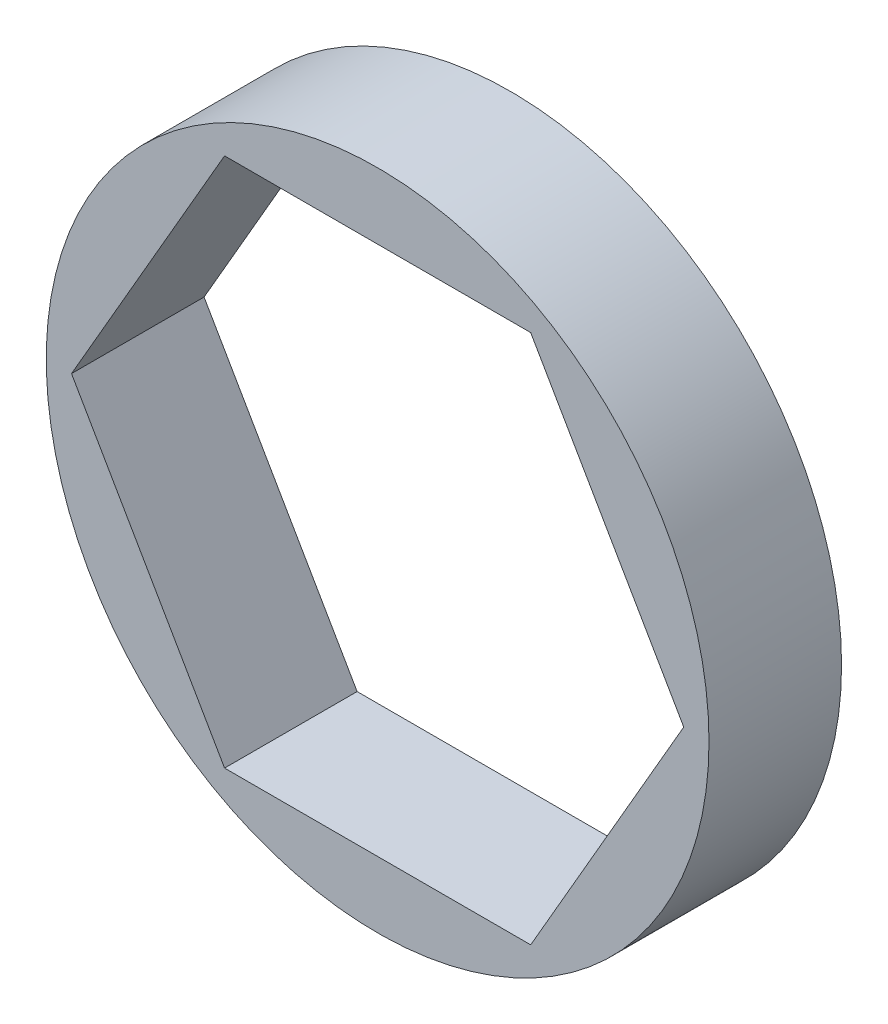
ISO-10303-21;
HEADER;
FILE_DESCRIPTION(('STEP AP214'),'2;1');
FILE_NAME('part.step','',(''),(''),'','','');
FILE_SCHEMA(('AUTOMOTIVE_DESIGN { 1 0 10303 214 1 1 1 1 }'));
ENDSEC;
DATA;
#1=APPLICATION_CONTEXT('core data for automotive mechanical design processes');
#2=APPLICATION_PROTOCOL_DEFINITION('international standard','automotive_design',2000,#1);
#3=PRODUCT_CONTEXT('',#1,'mechanical');
#4=PRODUCT('Part','Part','',(#3));
#5=PRODUCT_RELATED_PRODUCT_CATEGORY('part','',(#4));
#6=PRODUCT_DEFINITION_FORMATION('','',#4);
#7=PRODUCT_DEFINITION_CONTEXT('part definition',#1,'design');
#8=PRODUCT_DEFINITION('design','',#6,#7);
#9=PRODUCT_DEFINITION_SHAPE('','',#8);
#10=(LENGTH_UNIT() NAMED_UNIT(*) SI_UNIT(.MILLI.,.METRE.));
#11=(NAMED_UNIT(*) PLANE_ANGLE_UNIT() SI_UNIT($,.RADIAN.));
#12=(NAMED_UNIT(*) SI_UNIT($,.STERADIAN.) SOLID_ANGLE_UNIT());
#13=UNCERTAINTY_MEASURE_WITH_UNIT(LENGTH_MEASURE(1.E-05),#10,'distance_accuracy_value','');
#14=(GEOMETRIC_REPRESENTATION_CONTEXT(3) GLOBAL_UNCERTAINTY_ASSIGNED_CONTEXT((#13)) GLOBAL_UNIT_ASSIGNED_CONTEXT((#10,
#11,#12)) REPRESENTATION_CONTEXT('',''));
#15=CARTESIAN_POINT('',(0.,0.,0.));
#16=DIRECTION('',(0.,0.,1.));
#17=DIRECTION('',(1.,0.,0.));
#18=AXIS2_PLACEMENT_3D('',#15,#16,#17);
#19=CARTESIAN_POINT('',(0.,0.,3.175));
#20=DIRECTION('',(0.,0.,1.));
#21=DIRECTION('',(1.,0.,0.));
#22=AXIS2_PLACEMENT_3D('',#19,#20,#21);
#23=PLANE('',#22);
#24=CARTESIAN_POINT('',(0.,0.,3.175));
#25=DIRECTION('',(0.,0.,1.));
#26=DIRECTION('',(1.,0.,0.));
#27=AXIS2_PLACEMENT_3D('',#24,#25,#26);
#28=CIRCLE('',#27,7.9375);
#29=CARTESIAN_POINT('',(7.9375,0.,3.175));
#30=VERTEX_POINT('',#29);
#31=EDGE_CURVE('E11',#30,#30,#28,.T.);
#32=ORIENTED_EDGE('',*,*,#31,.T.);
#33=EDGE_LOOP('',(#32));
#34=FACE_BOUND('',#33,.T.);
#35=DIRECTION('',(1.,0.,0.));
#36=VECTOR('',#35,1.);
#37=CARTESIAN_POINT('',(-3.66617420935412,-6.35,3.175));
#38=LINE('',#37,#36);
#39=CARTESIAN_POINT('',(-3.66617420935412,-6.35,3.175));
#40=VERTEX_POINT('',#39);
#41=CARTESIAN_POINT('',(3.66617420935412,-6.35,3.175));
#42=VERTEX_POINT('',#41);
#43=EDGE_CURVE('E94',#40,#42,#38,.T.);
#44=ORIENTED_EDGE('',*,*,#43,.F.);
#45=DIRECTION('',(0.5,-0.866025403784438,0.));
#46=VECTOR('',#45,1.);
#47=CARTESIAN_POINT('',(-7.33234841870825,0.,3.175));
#48=LINE('',#47,#46);
#49=CARTESIAN_POINT('',(-7.33234841870825,0.,3.175));
#50=VERTEX_POINT('',#49);
#51=EDGE_CURVE('E86',#50,#40,#48,.T.);
#52=ORIENTED_EDGE('',*,*,#51,.F.);
#53=DIRECTION('',(-0.5,-0.866025403784439,0.));
#54=VECTOR('',#53,1.);
#55=CARTESIAN_POINT('',(-3.66617420935412,6.35,3.175));
#56=LINE('',#55,#54);
#57=CARTESIAN_POINT('',(-3.66617420935412,6.35,3.175));
#58=VERTEX_POINT('',#57);
#59=EDGE_CURVE('E114',#58,#50,#56,.T.);
#60=ORIENTED_EDGE('',*,*,#59,.F.);
#61=DIRECTION('',(-1.,0.,0.));
#62=VECTOR('',#61,1.);
#63=CARTESIAN_POINT('',(3.66617420935412,6.35,3.175));
#64=LINE('',#63,#62);
#65=CARTESIAN_POINT('',(3.66617420935412,6.35,3.175));
#66=VERTEX_POINT('',#65);
#67=EDGE_CURVE('E112',#66,#58,#64,.T.);
#68=ORIENTED_EDGE('',*,*,#67,.F.);
#69=DIRECTION('',(-0.5,0.866025403784438,0.));
#70=VECTOR('',#69,1.);
#71=CARTESIAN_POINT('',(7.33234841870824,0.,3.175));
#72=LINE('',#71,#70);
#73=CARTESIAN_POINT('',(7.33234841870824,0.,3.175));
#74=VERTEX_POINT('',#73);
#75=EDGE_CURVE('E108',#74,#66,#72,.T.);
#76=ORIENTED_EDGE('',*,*,#75,.F.);
#77=DIRECTION('',(0.5,0.866025403784439,0.));
#78=VECTOR('',#77,1.);
#79=CARTESIAN_POINT('',(3.66617420935412,-6.35,3.175));
#80=LINE('',#79,#78);
#81=EDGE_CURVE('E106',#42,#74,#80,.T.);
#82=ORIENTED_EDGE('',*,*,#81,.F.);
#83=EDGE_LOOP('',(#44,#52,#60,#68,#76,#82));
#84=FACE_BOUND('',#83,.T.);
#85=ADVANCED_FACE('F33',(#34,#84),#23,.T.);
#86=CARTESIAN_POINT('',(0.,0.,0.));
#87=DIRECTION('',(0.,0.,1.));
#88=DIRECTION('',(1.,0.,0.));
#89=AXIS2_PLACEMENT_3D('',#86,#87,#88);
#90=PLANE('',#89);
#91=CARTESIAN_POINT('',(0.,0.,0.));
#92=DIRECTION('',(0.,0.,1.));
#93=DIRECTION('',(1.,0.,0.));
#94=AXIS2_PLACEMENT_3D('',#91,#92,#93);
#95=CIRCLE('',#94,7.9375);
#96=CARTESIAN_POINT('',(7.9375,0.,0.));
#97=VERTEX_POINT('',#96);
#98=EDGE_CURVE('E37',#97,#97,#95,.T.);
#99=ORIENTED_EDGE('',*,*,#98,.F.);
#100=EDGE_LOOP('',(#99));
#101=FACE_BOUND('',#100,.T.);
#102=DIRECTION('',(0.5,-0.866025403784438,0.));
#103=VECTOR('',#102,1.);
#104=CARTESIAN_POINT('',(-7.33234841870825,0.,0.));
#105=LINE('',#104,#103);
#106=CARTESIAN_POINT('',(-7.33234841870825,0.,0.));
#107=VERTEX_POINT('',#106);
#108=CARTESIAN_POINT('',(-3.66617420935412,-6.35,0.));
#109=VERTEX_POINT('',#108);
#110=EDGE_CURVE('E56',#107,#109,#105,.T.);
#111=ORIENTED_EDGE('',*,*,#110,.T.);
#112=DIRECTION('',(1.,0.,0.));
#113=VECTOR('',#112,1.);
#114=CARTESIAN_POINT('',(-3.66617420935412,-6.35,0.));
#115=LINE('',#114,#113);
#116=CARTESIAN_POINT('',(3.66617420935412,-6.35,0.));
#117=VERTEX_POINT('',#116);
#118=EDGE_CURVE('E101',#109,#117,#115,.T.);
#119=ORIENTED_EDGE('',*,*,#118,.T.);
#120=DIRECTION('',(0.5,0.866025403784439,0.));
#121=VECTOR('',#120,1.);
#122=CARTESIAN_POINT('',(3.66617420935412,-6.35,0.));
#123=LINE('',#122,#121);
#124=CARTESIAN_POINT('',(7.33234841870824,0.,0.));
#125=VERTEX_POINT('',#124);
#126=EDGE_CURVE('E118',#117,#125,#123,.T.);
#127=ORIENTED_EDGE('',*,*,#126,.T.);
#128=DIRECTION('',(-0.5,0.866025403784438,0.));
#129=VECTOR('',#128,1.);
#130=CARTESIAN_POINT('',(7.33234841870824,0.,0.));
#131=LINE('',#130,#129);
#132=CARTESIAN_POINT('',(3.66617420935412,6.35,0.));
#133=VERTEX_POINT('',#132);
#134=EDGE_CURVE('E121',#125,#133,#131,.T.);
#135=ORIENTED_EDGE('',*,*,#134,.T.);
#136=DIRECTION('',(-1.,0.,0.));
#137=VECTOR('',#136,1.);
#138=CARTESIAN_POINT('',(3.66617420935412,6.35,0.));
#139=LINE('',#138,#137);
#140=CARTESIAN_POINT('',(-3.66617420935412,6.35,0.));
#141=VERTEX_POINT('',#140);
#142=EDGE_CURVE('E124',#133,#141,#139,.T.);
#143=ORIENTED_EDGE('',*,*,#142,.T.);
#144=DIRECTION('',(-0.5,-0.866025403784439,0.));
#145=VECTOR('',#144,1.);
#146=CARTESIAN_POINT('',(-3.66617420935412,6.35,0.));
#147=LINE('',#146,#145);
#148=EDGE_CURVE('E95',#141,#107,#147,.T.);
#149=ORIENTED_EDGE('',*,*,#148,.T.);
#150=EDGE_LOOP('',(#111,#119,#127,#135,#143,#149));
#151=FACE_BOUND('',#150,.T.);
#152=ADVANCED_FACE('F141',(#101,#151),#90,.F.);
#153=CARTESIAN_POINT('',(0.,0.,3.175));
#154=DIRECTION('',(0.,0.,-1.));
#155=DIRECTION('',(-1.,0.,0.));
#156=AXIS2_PLACEMENT_3D('',#153,#154,#155);
#157=CYLINDRICAL_SURFACE('',#156,7.9375);
#158=ORIENTED_EDGE('',*,*,#31,.F.);
#159=EDGE_LOOP('',(#158));
#160=FACE_BOUND('',#159,.T.);
#161=ORIENTED_EDGE('',*,*,#98,.T.);
#162=EDGE_LOOP('',(#161));
#163=FACE_BOUND('',#162,.T.);
#164=ADVANCED_FACE('F35',(#160,#163),#157,.T.);
#165=CARTESIAN_POINT('',(-7.33234841870825,0.,3.175));
#166=DIRECTION('',(0.866025403784439,0.5,0.));
#167=DIRECTION('',(-0.5,0.866025403784439,0.));
#168=AXIS2_PLACEMENT_3D('',#165,#166,#167);
#169=PLANE('',#168);
#170=ORIENTED_EDGE('',*,*,#110,.F.);
#171=DIRECTION('',(0.,0.,-1.));
#172=VECTOR('',#171,1.);
#173=CARTESIAN_POINT('',(-7.33234841870825,0.,3.175));
#174=LINE('',#173,#172);
#175=EDGE_CURVE('E90',#50,#107,#174,.T.);
#176=ORIENTED_EDGE('',*,*,#175,.F.);
#177=ORIENTED_EDGE('',*,*,#51,.T.);
#178=DIRECTION('',(0.,0.,-1.));
#179=VECTOR('',#178,1.);
#180=CARTESIAN_POINT('',(-3.66617420935412,-6.35,3.175));
#181=LINE('',#180,#179);
#182=EDGE_CURVE('E89',#40,#109,#181,.T.);
#183=ORIENTED_EDGE('',*,*,#182,.T.);
#184=EDGE_LOOP('',(#170,#176,#177,#183));
#185=FACE_BOUND('',#184,.T.);
#186=ADVANCED_FACE('F88',(#185),#169,.T.);
#187=CARTESIAN_POINT('',(-3.66617420935412,-6.35,3.175));
#188=DIRECTION('',(0.,1.,0.));
#189=DIRECTION('',(-1.,0.,0.));
#190=AXIS2_PLACEMENT_3D('',#187,#188,#189);
#191=PLANE('',#190);
#192=ORIENTED_EDGE('',*,*,#118,.F.);
#193=ORIENTED_EDGE('',*,*,#182,.F.);
#194=ORIENTED_EDGE('',*,*,#43,.T.);
#195=DIRECTION('',(0.,0.,-1.));
#196=VECTOR('',#195,1.);
#197=CARTESIAN_POINT('',(3.66617420935412,-6.35,3.175));
#198=LINE('',#197,#196);
#199=EDGE_CURVE('E102',#42,#117,#198,.T.);
#200=ORIENTED_EDGE('',*,*,#199,.T.);
#201=EDGE_LOOP('',(#192,#193,#194,#200));
#202=FACE_BOUND('',#201,.T.);
#203=ADVANCED_FACE('F98',(#202),#191,.T.);
#204=CARTESIAN_POINT('',(3.66617420935412,-6.35,3.175));
#205=DIRECTION('',(-0.866025403784439,0.5,0.));
#206=DIRECTION('',(-0.5,-0.866025403784439,0.));
#207=AXIS2_PLACEMENT_3D('',#204,#205,#206);
#208=PLANE('',#207);
#209=ORIENTED_EDGE('',*,*,#126,.F.);
#210=ORIENTED_EDGE('',*,*,#199,.F.);
#211=ORIENTED_EDGE('',*,*,#81,.T.);
#212=DIRECTION('',(0.,0.,-1.));
#213=VECTOR('',#212,1.);
#214=CARTESIAN_POINT('',(7.33234841870824,0.,3.175));
#215=LINE('',#214,#213);
#216=EDGE_CURVE('E133',#74,#125,#215,.T.);
#217=ORIENTED_EDGE('',*,*,#216,.T.);
#218=EDGE_LOOP('',(#209,#210,#211,#217));
#219=FACE_BOUND('',#218,.T.);
#220=ADVANCED_FACE('F137',(#219),#208,.T.);
#221=CARTESIAN_POINT('',(7.33234841870824,0.,3.175));
#222=DIRECTION('',(-0.866025403784438,-0.5,0.));
#223=DIRECTION('',(0.500000000000001,-0.866025403784438,0.));
#224=AXIS2_PLACEMENT_3D('',#221,#222,#223);
#225=PLANE('',#224);
#226=ORIENTED_EDGE('',*,*,#134,.F.);
#227=ORIENTED_EDGE('',*,*,#216,.F.);
#228=ORIENTED_EDGE('',*,*,#75,.T.);
#229=DIRECTION('',(0.,0.,-1.));
#230=VECTOR('',#229,1.);
#231=CARTESIAN_POINT('',(3.66617420935412,6.35,3.175));
#232=LINE('',#231,#230);
#233=EDGE_CURVE('E131',#66,#133,#232,.T.);
#234=ORIENTED_EDGE('',*,*,#233,.T.);
#235=EDGE_LOOP('',(#226,#227,#228,#234));
#236=FACE_BOUND('',#235,.T.);
#237=ADVANCED_FACE('F149',(#236),#225,.T.);
#238=CARTESIAN_POINT('',(3.66617420935412,6.35,3.175));
#239=DIRECTION('',(0.,-1.,0.));
#240=DIRECTION('',(1.,0.,0.));
#241=AXIS2_PLACEMENT_3D('',#238,#239,#240);
#242=PLANE('',#241);
#243=ORIENTED_EDGE('',*,*,#142,.F.);
#244=ORIENTED_EDGE('',*,*,#233,.F.);
#245=ORIENTED_EDGE('',*,*,#67,.T.);
#246=DIRECTION('',(0.,0.,-1.));
#247=VECTOR('',#246,1.);
#248=CARTESIAN_POINT('',(-3.66617420935412,6.35,3.175));
#249=LINE('',#248,#247);
#250=EDGE_CURVE('E48',#58,#141,#249,.T.);
#251=ORIENTED_EDGE('',*,*,#250,.T.);
#252=EDGE_LOOP('',(#243,#244,#245,#251));
#253=FACE_BOUND('',#252,.T.);
#254=ADVANCED_FACE('F147',(#253),#242,.T.);
#255=CARTESIAN_POINT('',(-3.66617420935412,6.35,3.175));
#256=DIRECTION('',(0.866025403784439,-0.5,0.));
#257=DIRECTION('',(0.5,0.866025403784439,0.));
#258=AXIS2_PLACEMENT_3D('',#255,#256,#257);
#259=PLANE('',#258);
#260=ORIENTED_EDGE('',*,*,#148,.F.);
#261=ORIENTED_EDGE('',*,*,#250,.F.);
#262=ORIENTED_EDGE('',*,*,#59,.T.);
#263=ORIENTED_EDGE('',*,*,#175,.T.);
#264=EDGE_LOOP('',(#260,#261,#262,#263));
#265=FACE_BOUND('',#264,.T.);
#266=ADVANCED_FACE('F143',(#265),#259,.T.);
#267=CLOSED_SHELL('',(#85,#152,#164,#186,#203,#220,#237,#254,#266));
#268=MANIFOLD_SOLID_BREP('B2',#267);
#269=ADVANCED_BREP_SHAPE_REPRESENTATION('',(#18,#268),#14);
#270=SHAPE_DEFINITION_REPRESENTATION(#9,#269);
ENDSEC;
END-ISO-10303-21;
